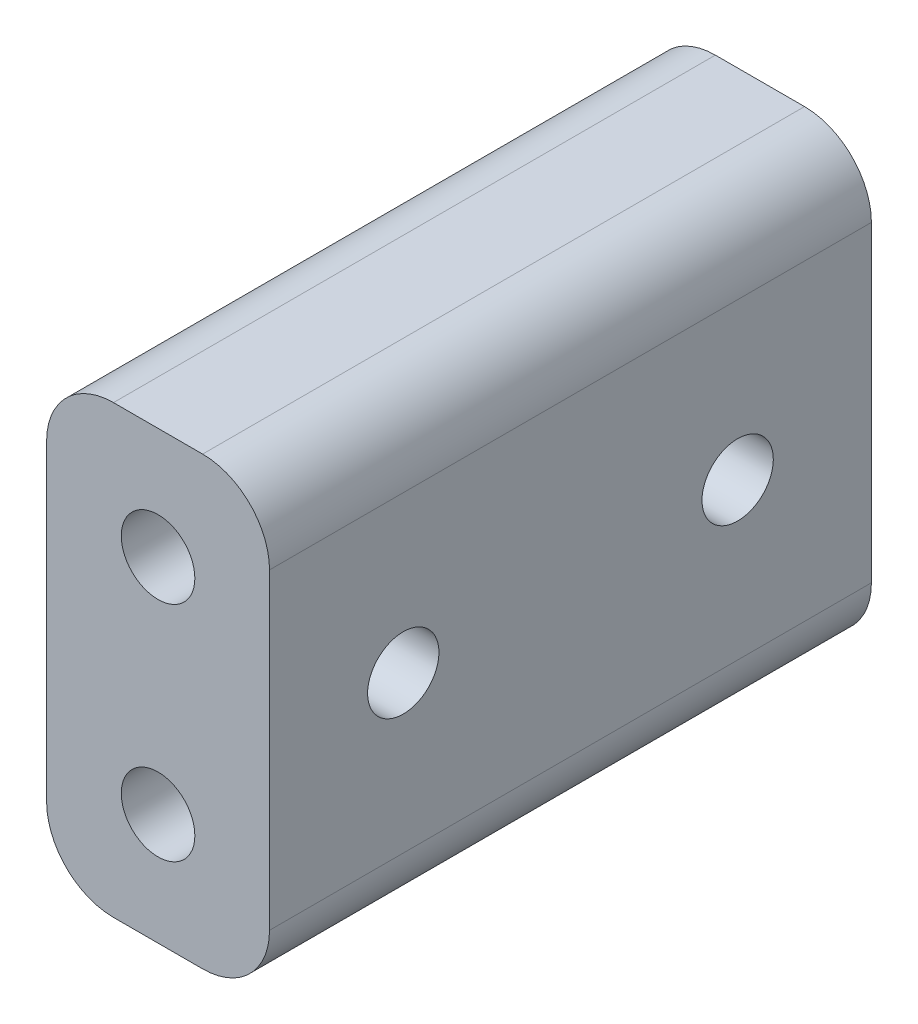
ISO-10303-21;
HEADER;
FILE_DESCRIPTION(('STEP AP214'),'2;1');
FILE_NAME('part.step','',(''),(''),'','','');
FILE_SCHEMA(('AUTOMOTIVE_DESIGN { 1 0 10303 214 1 1 1 1 }'));
ENDSEC;
DATA;
#1=APPLICATION_CONTEXT('core data for automotive mechanical design processes');
#2=APPLICATION_PROTOCOL_DEFINITION('international standard','automotive_design',2000,#1);
#3=PRODUCT_CONTEXT('',#1,'mechanical');
#4=PRODUCT('Part','Part','',(#3));
#5=PRODUCT_RELATED_PRODUCT_CATEGORY('part','',(#4));
#6=PRODUCT_DEFINITION_FORMATION('','',#4);
#7=PRODUCT_DEFINITION_CONTEXT('part definition',#1,'design');
#8=PRODUCT_DEFINITION('design','',#6,#7);
#9=PRODUCT_DEFINITION_SHAPE('','',#8);
#10=(LENGTH_UNIT() NAMED_UNIT(*) SI_UNIT(.MILLI.,.METRE.));
#11=(NAMED_UNIT(*) PLANE_ANGLE_UNIT() SI_UNIT($,.RADIAN.));
#12=(NAMED_UNIT(*) SI_UNIT($,.STERADIAN.) SOLID_ANGLE_UNIT());
#13=UNCERTAINTY_MEASURE_WITH_UNIT(LENGTH_MEASURE(1.E-05),#10,'distance_accuracy_value','');
#14=(GEOMETRIC_REPRESENTATION_CONTEXT(3) GLOBAL_UNCERTAINTY_ASSIGNED_CONTEXT((#13)) GLOBAL_UNIT_ASSIGNED_CONTEXT((#10,
#11,#12)) REPRESENTATION_CONTEXT('',''));
#15=CARTESIAN_POINT('',(0.,0.,0.));
#16=DIRECTION('',(0.,0.,1.));
#17=DIRECTION('',(1.,0.,0.));
#18=AXIS2_PLACEMENT_3D('',#15,#16,#17);
#19=CARTESIAN_POINT('',(0.,0.,27.));
#20=DIRECTION('',(0.,0.,1.));
#21=DIRECTION('',(1.,0.,0.));
#22=AXIS2_PLACEMENT_3D('',#19,#20,#21);
#23=PLANE('',#22);
#24=CARTESIAN_POINT('',(5.,-5.,27.));
#25=DIRECTION('',(0.,0.,1.));
#26=DIRECTION('',(1.,0.,0.));
#27=AXIS2_PLACEMENT_3D('',#24,#25,#26);
#28=CIRCLE('',#27,1.65);
#29=CARTESIAN_POINT('',(6.65,-5.,27.));
#30=VERTEX_POINT('',#29);
#31=EDGE_CURVE('E136',#30,#30,#28,.T.);
#32=ORIENTED_EDGE('',*,*,#31,.F.);
#33=EDGE_LOOP('',(#32));
#34=FACE_BOUND('',#33,.T.);
#35=DIRECTION('',(-1.,0.,0.));
#36=VECTOR('',#35,1.);
#37=CARTESIAN_POINT('',(0.,0.,27.));
#38=LINE('',#37,#36);
#39=CARTESIAN_POINT('',(7.,0.,27.));
#40=VERTEX_POINT('',#39);
#41=CARTESIAN_POINT('',(3.,0.,27.));
#42=VERTEX_POINT('',#41);
#43=EDGE_CURVE('E145',#40,#42,#38,.T.);
#44=ORIENTED_EDGE('',*,*,#43,.T.);
#45=CARTESIAN_POINT('',(3.,-3.,27.));
#46=DIRECTION('',(0.,0.,1.));
#47=DIRECTION('',(1.,0.,0.));
#48=AXIS2_PLACEMENT_3D('',#45,#46,#47);
#49=CIRCLE('',#48,3.);
#50=CARTESIAN_POINT('',(0.,-3.,27.));
#51=VERTEX_POINT('',#50);
#52=EDGE_CURVE('E163',#42,#51,#49,.T.);
#53=ORIENTED_EDGE('',*,*,#52,.T.);
#54=DIRECTION('',(0.,-1.,0.));
#55=VECTOR('',#54,1.);
#56=CARTESIAN_POINT('',(0.,0.,27.));
#57=LINE('',#56,#55);
#58=CARTESIAN_POINT('',(0.,-17.,27.));
#59=VERTEX_POINT('',#58);
#60=EDGE_CURVE('E127',#51,#59,#57,.T.);
#61=ORIENTED_EDGE('',*,*,#60,.T.);
#62=CARTESIAN_POINT('',(3.,-17.,27.));
#63=DIRECTION('',(0.,0.,1.));
#64=DIRECTION('',(1.,0.,0.));
#65=AXIS2_PLACEMENT_3D('',#62,#63,#64);
#66=CIRCLE('',#65,3.);
#67=CARTESIAN_POINT('',(3.,-20.,27.));
#68=VERTEX_POINT('',#67);
#69=EDGE_CURVE('E160',#59,#68,#66,.T.);
#70=ORIENTED_EDGE('',*,*,#69,.T.);
#71=DIRECTION('',(1.,0.,0.));
#72=VECTOR('',#71,1.);
#73=CARTESIAN_POINT('',(0.,-20.,27.));
#74=LINE('',#73,#72);
#75=CARTESIAN_POINT('',(7.,-20.,27.));
#76=VERTEX_POINT('',#75);
#77=EDGE_CURVE('E174',#68,#76,#74,.T.);
#78=ORIENTED_EDGE('',*,*,#77,.T.);
#79=CARTESIAN_POINT('',(7.,-17.,27.));
#80=DIRECTION('',(0.,0.,1.));
#81=DIRECTION('',(1.,0.,0.));
#82=AXIS2_PLACEMENT_3D('',#79,#80,#81);
#83=CIRCLE('',#82,3.);
#84=CARTESIAN_POINT('',(10.,-17.,27.));
#85=VERTEX_POINT('',#84);
#86=EDGE_CURVE('E63',#76,#85,#83,.T.);
#87=ORIENTED_EDGE('',*,*,#86,.T.);
#88=DIRECTION('',(0.,1.,0.));
#89=VECTOR('',#88,1.);
#90=CARTESIAN_POINT('',(10.,0.,27.));
#91=LINE('',#90,#89);
#92=CARTESIAN_POINT('',(10.,-3.,27.));
#93=VERTEX_POINT('',#92);
#94=EDGE_CURVE('E182',#85,#93,#91,.T.);
#95=ORIENTED_EDGE('',*,*,#94,.T.);
#96=CARTESIAN_POINT('',(7.,-3.,27.));
#97=DIRECTION('',(0.,0.,1.));
#98=DIRECTION('',(1.,0.,0.));
#99=AXIS2_PLACEMENT_3D('',#96,#97,#98);
#100=CIRCLE('',#99,3.);
#101=EDGE_CURVE('E158',#93,#40,#100,.T.);
#102=ORIENTED_EDGE('',*,*,#101,.T.);
#103=EDGE_LOOP('',(#44,#53,#61,#70,#78,#87,#95,#102));
#104=FACE_BOUND('',#103,.T.);
#105=CARTESIAN_POINT('',(5.,-15.,27.));
#106=DIRECTION('',(0.,0.,1.));
#107=DIRECTION('',(1.,0.,0.));
#108=AXIS2_PLACEMENT_3D('',#105,#106,#107);
#109=CIRCLE('',#108,1.65);
#110=CARTESIAN_POINT('',(6.65,-15.,27.));
#111=VERTEX_POINT('',#110);
#112=EDGE_CURVE('E189',#111,#111,#109,.T.);
#113=ORIENTED_EDGE('',*,*,#112,.F.);
#114=EDGE_LOOP('',(#113));
#115=FACE_BOUND('',#114,.T.);
#116=ADVANCED_FACE('F41',(#34,#104,#115),#23,.T.);
#117=CARTESIAN_POINT('',(0.,0.,0.));
#118=DIRECTION('',(0.,0.,1.));
#119=DIRECTION('',(1.,0.,0.));
#120=AXIS2_PLACEMENT_3D('',#117,#118,#119);
#121=PLANE('',#120);
#122=DIRECTION('',(0.,-1.,0.));
#123=VECTOR('',#122,1.);
#124=CARTESIAN_POINT('',(0.,0.,0.));
#125=LINE('',#124,#123);
#126=CARTESIAN_POINT('',(0.,-3.,0.));
#127=VERTEX_POINT('',#126);
#128=CARTESIAN_POINT('',(0.,-17.,0.));
#129=VERTEX_POINT('',#128);
#130=EDGE_CURVE('E124',#127,#129,#125,.T.);
#131=ORIENTED_EDGE('',*,*,#130,.F.);
#132=CARTESIAN_POINT('',(3.,-3.,0.));
#133=DIRECTION('',(0.,0.,1.));
#134=DIRECTION('',(1.,0.,0.));
#135=AXIS2_PLACEMENT_3D('',#132,#133,#134);
#136=CIRCLE('',#135,3.);
#137=CARTESIAN_POINT('',(3.,0.,0.));
#138=VERTEX_POINT('',#137);
#139=EDGE_CURVE('E107',#127,#138,#136,.F.);
#140=ORIENTED_EDGE('',*,*,#139,.T.);
#141=DIRECTION('',(-1.,0.,0.));
#142=VECTOR('',#141,1.);
#143=CARTESIAN_POINT('',(0.,0.,0.));
#144=LINE('',#143,#142);
#145=CARTESIAN_POINT('',(7.,0.,0.));
#146=VERTEX_POINT('',#145);
#147=EDGE_CURVE('E149',#146,#138,#144,.T.);
#148=ORIENTED_EDGE('',*,*,#147,.F.);
#149=CARTESIAN_POINT('',(7.,-3.,0.));
#150=DIRECTION('',(0.,0.,1.));
#151=DIRECTION('',(1.,0.,0.));
#152=AXIS2_PLACEMENT_3D('',#149,#150,#151);
#153=CIRCLE('',#152,3.);
#154=CARTESIAN_POINT('',(10.,-3.,0.));
#155=VERTEX_POINT('',#154);
#156=EDGE_CURVE('E128',#146,#155,#153,.F.);
#157=ORIENTED_EDGE('',*,*,#156,.T.);
#158=DIRECTION('',(0.,1.,0.));
#159=VECTOR('',#158,1.);
#160=CARTESIAN_POINT('',(10.,0.,0.));
#161=LINE('',#160,#159);
#162=CARTESIAN_POINT('',(10.,-17.,0.));
#163=VERTEX_POINT('',#162);
#164=EDGE_CURVE('E139',#163,#155,#161,.T.);
#165=ORIENTED_EDGE('',*,*,#164,.F.);
#166=CARTESIAN_POINT('',(7.,-17.,0.));
#167=DIRECTION('',(0.,0.,1.));
#168=DIRECTION('',(1.,0.,0.));
#169=AXIS2_PLACEMENT_3D('',#166,#167,#168);
#170=CIRCLE('',#169,3.);
#171=CARTESIAN_POINT('',(7.,-20.,0.));
#172=VERTEX_POINT('',#171);
#173=EDGE_CURVE('E118',#163,#172,#170,.F.);
#174=ORIENTED_EDGE('',*,*,#173,.T.);
#175=DIRECTION('',(1.,0.,0.));
#176=VECTOR('',#175,1.);
#177=CARTESIAN_POINT('',(0.,-20.,0.));
#178=LINE('',#177,#176);
#179=CARTESIAN_POINT('',(3.,-20.,0.));
#180=VERTEX_POINT('',#179);
#181=EDGE_CURVE('E135',#180,#172,#178,.T.);
#182=ORIENTED_EDGE('',*,*,#181,.F.);
#183=CARTESIAN_POINT('',(3.,-17.,0.));
#184=DIRECTION('',(0.,0.,1.));
#185=DIRECTION('',(1.,0.,0.));
#186=AXIS2_PLACEMENT_3D('',#183,#184,#185);
#187=CIRCLE('',#186,3.);
#188=EDGE_CURVE('E134',#180,#129,#187,.F.);
#189=ORIENTED_EDGE('',*,*,#188,.T.);
#190=EDGE_LOOP('',(#131,#140,#148,#157,#165,#174,#182,#189));
#191=FACE_BOUND('',#190,.T.);
#192=CARTESIAN_POINT('',(5.,-5.,0.));
#193=DIRECTION('',(0.,0.,1.));
#194=DIRECTION('',(1.,0.,0.));
#195=AXIS2_PLACEMENT_3D('',#192,#193,#194);
#196=CIRCLE('',#195,1.65);
#197=CARTESIAN_POINT('',(6.65,-5.,0.));
#198=VERTEX_POINT('',#197);
#199=EDGE_CURVE('E142',#198,#198,#196,.T.);
#200=ORIENTED_EDGE('',*,*,#199,.T.);
#201=EDGE_LOOP('',(#200));
#202=FACE_BOUND('',#201,.T.);
#203=CARTESIAN_POINT('',(5.,-15.,0.));
#204=DIRECTION('',(0.,0.,1.));
#205=DIRECTION('',(1.,0.,0.));
#206=AXIS2_PLACEMENT_3D('',#203,#204,#205);
#207=CIRCLE('',#206,1.65);
#208=CARTESIAN_POINT('',(6.65,-15.,0.));
#209=VERTEX_POINT('',#208);
#210=EDGE_CURVE('E191',#209,#209,#207,.T.);
#211=ORIENTED_EDGE('',*,*,#210,.T.);
#212=EDGE_LOOP('',(#211));
#213=FACE_BOUND('',#212,.T.);
#214=ADVANCED_FACE('F131',(#191,#202,#213),#121,.F.);
#215=CARTESIAN_POINT('',(0.,0.,27.));
#216=DIRECTION('',(1.,0.,0.));
#217=DIRECTION('',(0.,1.,0.));
#218=AXIS2_PLACEMENT_3D('',#215,#216,#217);
#219=PLANE('',#218);
#220=CARTESIAN_POINT('',(0.,-10.,21.));
#221=DIRECTION('',(1.,0.,0.));
#222=DIRECTION('',(0.,1.,0.));
#223=AXIS2_PLACEMENT_3D('',#220,#221,#222);
#224=CIRCLE('',#223,1.6);
#225=CARTESIAN_POINT('',(0.,-8.4,21.));
#226=VERTEX_POINT('',#225);
#227=EDGE_CURVE('E194',#226,#226,#224,.T.);
#228=ORIENTED_EDGE('',*,*,#227,.T.);
#229=EDGE_LOOP('',(#228));
#230=FACE_BOUND('',#229,.T.);
#231=CARTESIAN_POINT('',(0.,-10.,6.));
#232=DIRECTION('',(1.,0.,0.));
#233=DIRECTION('',(0.,1.,0.));
#234=AXIS2_PLACEMENT_3D('',#231,#232,#233);
#235=CIRCLE('',#234,1.6);
#236=CARTESIAN_POINT('',(0.,-8.4,6.));
#237=VERTEX_POINT('',#236);
#238=EDGE_CURVE('E197',#237,#237,#235,.T.);
#239=ORIENTED_EDGE('',*,*,#238,.T.);
#240=EDGE_LOOP('',(#239));
#241=FACE_BOUND('',#240,.T.);
#242=ORIENTED_EDGE('',*,*,#60,.F.);
#243=DIRECTION('',(0.,0.,-1.));
#244=VECTOR('',#243,1.);
#245=CARTESIAN_POINT('',(0.,-3.,27.));
#246=LINE('',#245,#244);
#247=EDGE_CURVE('E111',#51,#127,#246,.T.);
#248=ORIENTED_EDGE('',*,*,#247,.T.);
#249=ORIENTED_EDGE('',*,*,#130,.T.);
#250=DIRECTION('',(0.,0.,-1.));
#251=VECTOR('',#250,1.);
#252=CARTESIAN_POINT('',(0.,-17.,27.));
#253=LINE('',#252,#251);
#254=EDGE_CURVE('E129',#129,#59,#253,.F.);
#255=ORIENTED_EDGE('',*,*,#254,.T.);
#256=EDGE_LOOP('',(#242,#248,#249,#255));
#257=FACE_BOUND('',#256,.T.);
#258=ADVANCED_FACE('F123',(#230,#241,#257),#219,.F.);
#259=CARTESIAN_POINT('',(0.,-20.,27.));
#260=DIRECTION('',(0.,1.,0.));
#261=DIRECTION('',(0.,0.,1.));
#262=AXIS2_PLACEMENT_3D('',#259,#260,#261);
#263=PLANE('',#262);
#264=ORIENTED_EDGE('',*,*,#181,.T.);
#265=DIRECTION('',(0.,0.,-1.));
#266=VECTOR('',#265,1.);
#267=CARTESIAN_POINT('',(7.,-20.,27.));
#268=LINE('',#267,#266);
#269=EDGE_CURVE('E11',#172,#76,#268,.F.);
#270=ORIENTED_EDGE('',*,*,#269,.T.);
#271=ORIENTED_EDGE('',*,*,#77,.F.);
#272=DIRECTION('',(0.,0.,-1.));
#273=VECTOR('',#272,1.);
#274=CARTESIAN_POINT('',(3.,-20.,27.));
#275=LINE('',#274,#273);
#276=EDGE_CURVE('E49',#68,#180,#275,.T.);
#277=ORIENTED_EDGE('',*,*,#276,.T.);
#278=EDGE_LOOP('',(#264,#270,#271,#277));
#279=FACE_BOUND('',#278,.T.);
#280=ADVANCED_FACE('F172',(#279),#263,.F.);
#281=CARTESIAN_POINT('',(10.,0.,27.));
#282=DIRECTION('',(-1.,0.,0.));
#283=DIRECTION('',(0.,-1.,0.));
#284=AXIS2_PLACEMENT_3D('',#281,#282,#283);
#285=PLANE('',#284);
#286=CARTESIAN_POINT('',(10.,-10.,21.));
#287=DIRECTION('',(1.,0.,0.));
#288=DIRECTION('',(0.,1.,0.));
#289=AXIS2_PLACEMENT_3D('',#286,#287,#288);
#290=CIRCLE('',#289,1.6);
#291=CARTESIAN_POINT('',(10.,-8.39999999999999,21.));
#292=VERTEX_POINT('',#291);
#293=EDGE_CURVE('E203',#292,#292,#290,.T.);
#294=ORIENTED_EDGE('',*,*,#293,.F.);
#295=EDGE_LOOP('',(#294));
#296=FACE_BOUND('',#295,.T.);
#297=CARTESIAN_POINT('',(10.,-10.,6.));
#298=DIRECTION('',(1.,0.,0.));
#299=DIRECTION('',(0.,1.,0.));
#300=AXIS2_PLACEMENT_3D('',#297,#298,#299);
#301=CIRCLE('',#300,1.6);
#302=CARTESIAN_POINT('',(10.,-8.4,6.));
#303=VERTEX_POINT('',#302);
#304=EDGE_CURVE('E200',#303,#303,#301,.T.);
#305=ORIENTED_EDGE('',*,*,#304,.F.);
#306=EDGE_LOOP('',(#305));
#307=FACE_BOUND('',#306,.T.);
#308=ORIENTED_EDGE('',*,*,#94,.F.);
#309=DIRECTION('',(0.,0.,-1.));
#310=VECTOR('',#309,1.);
#311=CARTESIAN_POINT('',(10.,-17.,27.));
#312=LINE('',#311,#310);
#313=EDGE_CURVE('E166',#85,#163,#312,.T.);
#314=ORIENTED_EDGE('',*,*,#313,.T.);
#315=ORIENTED_EDGE('',*,*,#164,.T.);
#316=DIRECTION('',(0.,0.,-1.));
#317=VECTOR('',#316,1.);
#318=CARTESIAN_POINT('',(10.,-3.,27.));
#319=LINE('',#318,#317);
#320=EDGE_CURVE('E56',#155,#93,#319,.F.);
#321=ORIENTED_EDGE('',*,*,#320,.T.);
#322=EDGE_LOOP('',(#308,#314,#315,#321));
#323=FACE_BOUND('',#322,.T.);
#324=ADVANCED_FACE('F181',(#296,#307,#323),#285,.F.);
#325=CARTESIAN_POINT('',(0.,0.,27.));
#326=DIRECTION('',(0.,-1.,0.));
#327=DIRECTION('',(0.,0.,-1.));
#328=AXIS2_PLACEMENT_3D('',#325,#326,#327);
#329=PLANE('',#328);
#330=ORIENTED_EDGE('',*,*,#147,.T.);
#331=DIRECTION('',(0.,0.,-1.));
#332=VECTOR('',#331,1.);
#333=CARTESIAN_POINT('',(3.,0.,27.));
#334=LINE('',#333,#332);
#335=EDGE_CURVE('E112',#138,#42,#334,.F.);
#336=ORIENTED_EDGE('',*,*,#335,.T.);
#337=ORIENTED_EDGE('',*,*,#43,.F.);
#338=DIRECTION('',(0.,0.,-1.));
#339=VECTOR('',#338,1.);
#340=CARTESIAN_POINT('',(7.,0.,27.));
#341=LINE('',#340,#339);
#342=EDGE_CURVE('E117',#40,#146,#341,.T.);
#343=ORIENTED_EDGE('',*,*,#342,.T.);
#344=EDGE_LOOP('',(#330,#336,#337,#343));
#345=FACE_BOUND('',#344,.T.);
#346=ADVANCED_FACE('F220',(#345),#329,.F.);
#347=CARTESIAN_POINT('',(5.,-5.,27.));
#348=DIRECTION('',(0.,0.,-1.));
#349=DIRECTION('',(-1.,0.,0.));
#350=AXIS2_PLACEMENT_3D('',#347,#348,#349);
#351=CYLINDRICAL_SURFACE('',#350,1.65);
#352=ORIENTED_EDGE('',*,*,#31,.T.);
#353=EDGE_LOOP('',(#352));
#354=FACE_BOUND('',#353,.T.);
#355=ORIENTED_EDGE('',*,*,#199,.F.);
#356=EDGE_LOOP('',(#355));
#357=FACE_BOUND('',#356,.T.);
#358=ADVANCED_FACE('F244',(#354,#357),#351,.F.);
#359=CARTESIAN_POINT('',(5.,-15.,27.));
#360=DIRECTION('',(0.,0.,-1.));
#361=DIRECTION('',(-1.,0.,0.));
#362=AXIS2_PLACEMENT_3D('',#359,#360,#361);
#363=CYLINDRICAL_SURFACE('',#362,1.65);
#364=ORIENTED_EDGE('',*,*,#112,.T.);
#365=EDGE_LOOP('',(#364));
#366=FACE_BOUND('',#365,.T.);
#367=ORIENTED_EDGE('',*,*,#210,.F.);
#368=EDGE_LOOP('',(#367));
#369=FACE_BOUND('',#368,.T.);
#370=ADVANCED_FACE('F255',(#366,#369),#363,.F.);
#371=CARTESIAN_POINT('',(3.,-3.,27.));
#372=DIRECTION('',(0.,0.,-1.));
#373=DIRECTION('',(-1.,0.,0.));
#374=AXIS2_PLACEMENT_3D('',#371,#372,#373);
#375=CYLINDRICAL_SURFACE('',#374,3.);
#376=ORIENTED_EDGE('',*,*,#52,.F.);
#377=ORIENTED_EDGE('',*,*,#335,.F.);
#378=ORIENTED_EDGE('',*,*,#139,.F.);
#379=ORIENTED_EDGE('',*,*,#247,.F.);
#380=EDGE_LOOP('',(#376,#377,#378,#379));
#381=FACE_BOUND('',#380,.T.);
#382=ADVANCED_FACE('F110',(#381),#375,.T.);
#383=CARTESIAN_POINT('',(7.,-17.,27.));
#384=DIRECTION('',(0.,0.,-1.));
#385=DIRECTION('',(-1.,0.,0.));
#386=AXIS2_PLACEMENT_3D('',#383,#384,#385);
#387=CYLINDRICAL_SURFACE('',#386,3.);
#388=ORIENTED_EDGE('',*,*,#86,.F.);
#389=ORIENTED_EDGE('',*,*,#269,.F.);
#390=ORIENTED_EDGE('',*,*,#173,.F.);
#391=ORIENTED_EDGE('',*,*,#313,.F.);
#392=EDGE_LOOP('',(#388,#389,#390,#391));
#393=FACE_BOUND('',#392,.T.);
#394=ADVANCED_FACE('F180',(#393),#387,.T.);
#395=CARTESIAN_POINT('',(3.,-17.,27.));
#396=DIRECTION('',(0.,0.,-1.));
#397=DIRECTION('',(-1.,0.,0.));
#398=AXIS2_PLACEMENT_3D('',#395,#396,#397);
#399=CYLINDRICAL_SURFACE('',#398,3.);
#400=ORIENTED_EDGE('',*,*,#69,.F.);
#401=ORIENTED_EDGE('',*,*,#254,.F.);
#402=ORIENTED_EDGE('',*,*,#188,.F.);
#403=ORIENTED_EDGE('',*,*,#276,.F.);
#404=EDGE_LOOP('',(#400,#401,#402,#403));
#405=FACE_BOUND('',#404,.T.);
#406=ADVANCED_FACE('F230',(#405),#399,.T.);
#407=CARTESIAN_POINT('',(7.,-3.,27.));
#408=DIRECTION('',(0.,0.,-1.));
#409=DIRECTION('',(-1.,0.,0.));
#410=AXIS2_PLACEMENT_3D('',#407,#408,#409);
#411=CYLINDRICAL_SURFACE('',#410,3.);
#412=ORIENTED_EDGE('',*,*,#101,.F.);
#413=ORIENTED_EDGE('',*,*,#320,.F.);
#414=ORIENTED_EDGE('',*,*,#156,.F.);
#415=ORIENTED_EDGE('',*,*,#342,.F.);
#416=EDGE_LOOP('',(#412,#413,#414,#415));
#417=FACE_BOUND('',#416,.T.);
#418=ADVANCED_FACE('F43',(#417),#411,.T.);
#419=CARTESIAN_POINT('',(0.,-10.,6.));
#420=DIRECTION('',(1.,0.,0.));
#421=DIRECTION('',(0.,1.,0.));
#422=AXIS2_PLACEMENT_3D('',#419,#420,#421);
#423=CYLINDRICAL_SURFACE('',#422,1.6);
#424=CARTESIAN_POINT('',(0.,-8.4,6.));
#425=CARTESIAN_POINT('',(0.104166666666663,-8.4,6.));
#426=CARTESIAN_POINT('',(0.20833333333333,-8.4,6.));
#427=CARTESIAN_POINT('',(0.416666666666663,-8.4,6.));
#428=CARTESIAN_POINT('',(0.52083333333333,-8.4,6.));
#429=CARTESIAN_POINT('',(0.729166666666663,-8.4,6.));
#430=CARTESIAN_POINT('',(0.83333333333333,-8.4,6.));
#431=CARTESIAN_POINT('',(1.04166666666666,-8.4,6.));
#432=CARTESIAN_POINT('',(1.14583333333333,-8.4,6.));
#433=CARTESIAN_POINT('',(1.35416666666666,-8.4,6.));
#434=CARTESIAN_POINT('',(1.45833333333333,-8.4,6.));
#435=CARTESIAN_POINT('',(1.66666666666666,-8.4,6.));
#436=CARTESIAN_POINT('',(1.77083333333333,-8.4,6.));
#437=CARTESIAN_POINT('',(1.97916666666666,-8.4,6.));
#438=CARTESIAN_POINT('',(2.08333333333333,-8.4,6.));
#439=CARTESIAN_POINT('',(2.29166666666666,-8.4,6.));
#440=CARTESIAN_POINT('',(2.39583333333333,-8.4,6.));
#441=CARTESIAN_POINT('',(2.60416666666666,-8.4,6.));
#442=CARTESIAN_POINT('',(2.70833333333333,-8.4,6.));
#443=CARTESIAN_POINT('',(2.91666666666666,-8.4,6.));
#444=CARTESIAN_POINT('',(3.02083333333333,-8.4,6.));
#445=CARTESIAN_POINT('',(3.22916666666666,-8.4,6.));
#446=CARTESIAN_POINT('',(3.33333333333333,-8.4,6.));
#447=CARTESIAN_POINT('',(3.54166666666666,-8.4,6.));
#448=CARTESIAN_POINT('',(3.64583333333333,-8.4,6.));
#449=CARTESIAN_POINT('',(3.85416666666666,-8.4,6.));
#450=CARTESIAN_POINT('',(3.95833333333333,-8.4,6.));
#451=CARTESIAN_POINT('',(4.16666666666666,-8.4,6.));
#452=CARTESIAN_POINT('',(4.27083333333333,-8.4,6.));
#453=CARTESIAN_POINT('',(4.47916666666666,-8.4,6.));
#454=CARTESIAN_POINT('',(4.58333333333333,-8.4,6.));
#455=CARTESIAN_POINT('',(4.79166666666666,-8.4,6.));
#456=CARTESIAN_POINT('',(4.89583333333333,-8.4,6.));
#457=CARTESIAN_POINT('',(5.10416666666667,-8.4,6.));
#458=CARTESIAN_POINT('',(5.20833333333333,-8.4,6.));
#459=CARTESIAN_POINT('',(5.41666666666667,-8.4,6.));
#460=CARTESIAN_POINT('',(5.52083333333333,-8.4,6.));
#461=CARTESIAN_POINT('',(5.72916666666667,-8.4,6.));
#462=CARTESIAN_POINT('',(5.83333333333333,-8.4,6.));
#463=CARTESIAN_POINT('',(6.04166666666667,-8.4,6.));
#464=CARTESIAN_POINT('',(6.14583333333333,-8.4,6.));
#465=CARTESIAN_POINT('',(6.35416666666667,-8.4,6.));
#466=CARTESIAN_POINT('',(6.45833333333333,-8.4,6.));
#467=CARTESIAN_POINT('',(6.66666666666667,-8.4,6.));
#468=CARTESIAN_POINT('',(6.77083333333333,-8.4,6.));
#469=CARTESIAN_POINT('',(6.97916666666667,-8.4,6.));
#470=CARTESIAN_POINT('',(7.08333333333333,-8.4,6.));
#471=CARTESIAN_POINT('',(7.29166666666667,-8.4,6.));
#472=CARTESIAN_POINT('',(7.39583333333333,-8.4,6.));
#473=CARTESIAN_POINT('',(7.60416666666667,-8.4,6.));
#474=CARTESIAN_POINT('',(7.70833333333333,-8.4,6.));
#475=CARTESIAN_POINT('',(7.91666666666667,-8.4,6.));
#476=CARTESIAN_POINT('',(8.02083333333333,-8.4,6.));
#477=CARTESIAN_POINT('',(8.22916666666667,-8.4,6.));
#478=CARTESIAN_POINT('',(8.33333333333333,-8.4,6.));
#479=CARTESIAN_POINT('',(8.54166666666667,-8.4,6.));
#480=CARTESIAN_POINT('',(8.64583333333333,-8.4,6.));
#481=CARTESIAN_POINT('',(8.85416666666667,-8.4,6.));
#482=CARTESIAN_POINT('',(8.95833333333333,-8.4,6.));
#483=CARTESIAN_POINT('',(9.16666666666667,-8.4,6.));
#484=CARTESIAN_POINT('',(9.27083333333333,-8.4,6.));
#485=CARTESIAN_POINT('',(9.47916666666667,-8.4,6.));
#486=CARTESIAN_POINT('',(9.58333333333333,-8.4,6.));
#487=CARTESIAN_POINT('',(9.79166666666667,-8.4,6.));
#488=CARTESIAN_POINT('',(9.89583333333333,-8.4,6.));
#489=CARTESIAN_POINT('',(10.,-8.4,6.));
#490=B_SPLINE_CURVE_WITH_KNOTS('',3,(#424,#425,#426,#427,#428,#429,#430,#431,#432,#433,#434,
#435,#436,#437,#438,#439,#440,#441,#442,#443,#444,#445,#446,#447,#448,#449,#450,#451,#452,#453,
#454,#455,#456,#457,#458,#459,#460,#461,#462,#463,#464,#465,#466,#467,#468,#469,#470,#471,#472,
#473,#474,#475,#476,#477,#478,#479,#480,#481,#482,#483,#484,#485,#486,#487,#488,#489),
.UNSPECIFIED.,.F.,.F.,(4,2,2,2,2,2,2,2,2,2,2,2,2,2,2,2,2,2,2,2,2,2,2,2,2,2,2,2,2,2,2,2,4),(0.,
0.3125,0.625,0.937500000000001,1.25,1.5625,1.875,2.1875,2.5,2.8125,3.125,3.4375,3.75,4.0625,
4.375,4.6875,5.,5.3125,5.625,5.9375,6.25,6.5625,6.875,7.1875,7.5,7.8125,8.125,8.4375,8.75,
9.06250000000001,9.37500000000001,9.68750000000001,10.),.UNSPECIFIED.);
#491=EDGE_CURVE('BSEAM214',#237,#303,#490,.T.);
#492=ORIENTED_EDGE('',*,*,#238,.F.);
#493=ORIENTED_EDGE('',*,*,#304,.T.);
#494=ORIENTED_EDGE('',*,*,#491,.T.);
#495=ORIENTED_EDGE('',*,*,#491,.F.);
#496=EDGE_LOOP('',(#492,#494,#493,#495));
#497=FACE_BOUND('',#496,.T.);
#498=ADVANCED_FACE('F214',(#497),#423,.F.);
#499=CARTESIAN_POINT('',(0.,-10.,21.));
#500=DIRECTION('',(1.,0.,0.));
#501=DIRECTION('',(0.,1.,0.));
#502=AXIS2_PLACEMENT_3D('',#499,#500,#501);
#503=CYLINDRICAL_SURFACE('',#502,1.6);
#504=CARTESIAN_POINT('',(0.,-8.4,21.));
#505=CARTESIAN_POINT('',(0.104166666666665,-8.4,21.));
#506=CARTESIAN_POINT('',(0.208333333333331,-8.4,21.));
#507=CARTESIAN_POINT('',(0.416666666666665,-8.4,21.));
#508=CARTESIAN_POINT('',(0.520833333333332,-8.4,21.));
#509=CARTESIAN_POINT('',(0.729166666666665,-8.4,21.));
#510=CARTESIAN_POINT('',(0.833333333333332,-8.4,21.));
#511=CARTESIAN_POINT('',(1.04166666666667,-8.4,21.));
#512=CARTESIAN_POINT('',(1.14583333333333,-8.4,21.));
#513=CARTESIAN_POINT('',(1.35416666666667,-8.4,21.));
#514=CARTESIAN_POINT('',(1.45833333333333,-8.4,21.));
#515=CARTESIAN_POINT('',(1.66666666666667,-8.4,21.));
#516=CARTESIAN_POINT('',(1.77083333333333,-8.4,21.));
#517=CARTESIAN_POINT('',(1.97916666666667,-8.4,21.));
#518=CARTESIAN_POINT('',(2.08333333333333,-8.4,21.));
#519=CARTESIAN_POINT('',(2.29166666666667,-8.4,21.));
#520=CARTESIAN_POINT('',(2.39583333333333,-8.4,21.));
#521=CARTESIAN_POINT('',(2.60416666666667,-8.4,21.));
#522=CARTESIAN_POINT('',(2.70833333333333,-8.4,21.));
#523=CARTESIAN_POINT('',(2.91666666666667,-8.4,21.));
#524=CARTESIAN_POINT('',(3.02083333333333,-8.4,21.));
#525=CARTESIAN_POINT('',(3.22916666666667,-8.4,21.));
#526=CARTESIAN_POINT('',(3.33333333333333,-8.4,21.));
#527=CARTESIAN_POINT('',(3.54166666666667,-8.4,21.));
#528=CARTESIAN_POINT('',(3.64583333333333,-8.4,21.));
#529=CARTESIAN_POINT('',(3.85416666666667,-8.4,21.));
#530=CARTESIAN_POINT('',(3.95833333333333,-8.4,21.));
#531=CARTESIAN_POINT('',(4.16666666666667,-8.4,21.));
#532=CARTESIAN_POINT('',(4.27083333333333,-8.4,21.));
#533=CARTESIAN_POINT('',(4.47916666666667,-8.4,21.));
#534=CARTESIAN_POINT('',(4.58333333333333,-8.4,21.));
#535=CARTESIAN_POINT('',(4.79166666666667,-8.4,21.));
#536=CARTESIAN_POINT('',(4.89583333333333,-8.4,21.));
#537=CARTESIAN_POINT('',(5.10416666666667,-8.4,21.));
#538=CARTESIAN_POINT('',(5.20833333333333,-8.4,21.));
#539=CARTESIAN_POINT('',(5.41666666666667,-8.4,21.));
#540=CARTESIAN_POINT('',(5.52083333333333,-8.4,21.));
#541=CARTESIAN_POINT('',(5.72916666666667,-8.4,21.));
#542=CARTESIAN_POINT('',(5.83333333333333,-8.4,21.));
#543=CARTESIAN_POINT('',(6.04166666666667,-8.4,21.));
#544=CARTESIAN_POINT('',(6.14583333333333,-8.4,21.));
#545=CARTESIAN_POINT('',(6.35416666666667,-8.4,21.));
#546=CARTESIAN_POINT('',(6.45833333333333,-8.4,21.));
#547=CARTESIAN_POINT('',(6.66666666666667,-8.4,21.));
#548=CARTESIAN_POINT('',(6.77083333333333,-8.4,21.));
#549=CARTESIAN_POINT('',(6.97916666666667,-8.4,21.));
#550=CARTESIAN_POINT('',(7.08333333333333,-8.4,21.));
#551=CARTESIAN_POINT('',(7.29166666666667,-8.4,21.));
#552=CARTESIAN_POINT('',(7.39583333333333,-8.4,21.));
#553=CARTESIAN_POINT('',(7.60416666666667,-8.4,21.));
#554=CARTESIAN_POINT('',(7.70833333333333,-8.4,21.));
#555=CARTESIAN_POINT('',(7.91666666666667,-8.4,21.));
#556=CARTESIAN_POINT('',(8.02083333333333,-8.4,21.));
#557=CARTESIAN_POINT('',(8.22916666666667,-8.4,21.));
#558=CARTESIAN_POINT('',(8.33333333333333,-8.4,21.));
#559=CARTESIAN_POINT('',(8.54166666666667,-8.4,21.));
#560=CARTESIAN_POINT('',(8.64583333333333,-8.4,21.));
#561=CARTESIAN_POINT('',(8.85416666666667,-8.4,21.));
#562=CARTESIAN_POINT('',(8.95833333333333,-8.4,21.));
#563=CARTESIAN_POINT('',(9.16666666666667,-8.4,21.));
#564=CARTESIAN_POINT('',(9.27083333333333,-8.4,21.));
#565=CARTESIAN_POINT('',(9.47916666666667,-8.4,21.));
#566=CARTESIAN_POINT('',(9.58333333333333,-8.4,21.));
#567=CARTESIAN_POINT('',(9.79166666666667,-8.4,21.));
#568=CARTESIAN_POINT('',(9.89583333333333,-8.4,21.));
#569=CARTESIAN_POINT('',(10.,-8.39999999999999,21.));
#570=B_SPLINE_CURVE_WITH_KNOTS('',3,(#504,#505,#506,#507,#508,#509,#510,#511,#512,#513,#514,
#515,#516,#517,#518,#519,#520,#521,#522,#523,#524,#525,#526,#527,#528,#529,#530,#531,#532,#533,
#534,#535,#536,#537,#538,#539,#540,#541,#542,#543,#544,#545,#546,#547,#548,#549,#550,#551,#552,
#553,#554,#555,#556,#557,#558,#559,#560,#561,#562,#563,#564,#565,#566,#567,#568,#569),
.UNSPECIFIED.,.F.,.F.,(4,2,2,2,2,2,2,2,2,2,2,2,2,2,2,2,2,2,2,2,2,2,2,2,2,2,2,2,2,2,2,2,4),(0.,
0.3125,0.625,0.937500000000001,1.25,1.5625,1.875,2.1875,2.5,2.8125,3.125,3.4375,3.75,4.0625,
4.375,4.6875,5.,5.3125,5.625,5.9375,6.25,6.5625,6.875,7.1875,7.5,7.8125,8.125,8.4375,8.75,
9.06250000000001,9.37500000000001,9.68750000000001,10.),.UNSPECIFIED.);
#571=EDGE_CURVE('BSEAM211',#226,#292,#570,.T.);
#572=ORIENTED_EDGE('',*,*,#227,.F.);
#573=ORIENTED_EDGE('',*,*,#293,.T.);
#574=ORIENTED_EDGE('',*,*,#571,.T.);
#575=ORIENTED_EDGE('',*,*,#571,.F.);
#576=EDGE_LOOP('',(#572,#574,#573,#575));
#577=FACE_BOUND('',#576,.T.);
#578=ADVANCED_FACE('F211',(#577),#503,.F.);
#579=CLOSED_SHELL('',(#116,#214,#258,#280,#324,#346,#358,#370,#382,#394,#406,#418,#498,#578));
#580=MANIFOLD_SOLID_BREP('B2',#579);
#581=ADVANCED_BREP_SHAPE_REPRESENTATION('',(#18,#580),#14);
#582=SHAPE_DEFINITION_REPRESENTATION(#9,#581);
ENDSEC;
END-ISO-10303-21;
